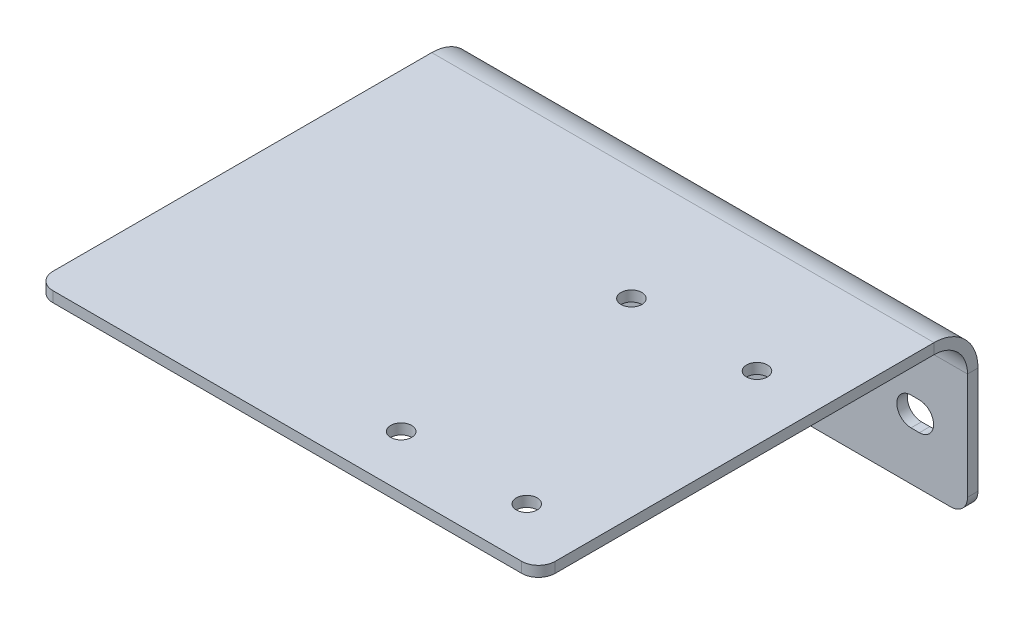
ISO-10303-21;
HEADER;
FILE_DESCRIPTION(('STEP AP214'),'2;1');
FILE_NAME('part.step','',(''),(''),'','','');
FILE_SCHEMA(('AUTOMOTIVE_DESIGN { 1 0 10303 214 1 1 1 1 }'));
ENDSEC;
DATA;
#1=APPLICATION_CONTEXT('core data for automotive mechanical design processes');
#2=APPLICATION_PROTOCOL_DEFINITION('international standard','automotive_design',2000,#1);
#3=PRODUCT_CONTEXT('',#1,'mechanical');
#4=PRODUCT('Part','Part','',(#3));
#5=PRODUCT_RELATED_PRODUCT_CATEGORY('part','',(#4));
#6=PRODUCT_DEFINITION_FORMATION('','',#4);
#7=PRODUCT_DEFINITION_CONTEXT('part definition',#1,'design');
#8=PRODUCT_DEFINITION('design','',#6,#7);
#9=PRODUCT_DEFINITION_SHAPE('','',#8);
#10=(LENGTH_UNIT() NAMED_UNIT(*) SI_UNIT(.MILLI.,.METRE.));
#11=(NAMED_UNIT(*) PLANE_ANGLE_UNIT() SI_UNIT($,.RADIAN.));
#12=(NAMED_UNIT(*) SI_UNIT($,.STERADIAN.) SOLID_ANGLE_UNIT());
#13=UNCERTAINTY_MEASURE_WITH_UNIT(LENGTH_MEASURE(1.E-05),#10,'distance_accuracy_value','');
#14=(GEOMETRIC_REPRESENTATION_CONTEXT(3) GLOBAL_UNCERTAINTY_ASSIGNED_CONTEXT((#13)) GLOBAL_UNIT_ASSIGNED_CONTEXT((#10,
#11,#12)) REPRESENTATION_CONTEXT('',''));
#15=CARTESIAN_POINT('',(0.,0.,0.));
#16=DIRECTION('',(0.,0.,1.));
#17=DIRECTION('',(1.,0.,0.));
#18=AXIS2_PLACEMENT_3D('',#15,#16,#17);
#19=CARTESIAN_POINT('',(0.,25.4,1.5875));
#20=DIRECTION('',(0.,0.,-1.));
#21=DIRECTION('',(-1.,0.,0.));
#22=AXIS2_PLACEMENT_3D('',#19,#20,#21);
#23=PLANE('',#22);
#24=DIRECTION('',(1.,0.,0.));
#25=VECTOR('',#24,1.);
#26=CARTESIAN_POINT('',(7.3025,7.37235,1.5875));
#27=LINE('',#26,#25);
#28=CARTESIAN_POINT('',(7.3025,7.37235,1.5875));
#29=VERTEX_POINT('',#28);
#30=CARTESIAN_POINT('',(8.5725,7.37235,1.5875));
#31=VERTEX_POINT('',#30);
#32=EDGE_CURVE('E240',#29,#31,#27,.T.);
#33=ORIENTED_EDGE('',*,*,#32,.F.);
#34=CARTESIAN_POINT('',(7.3025,9.525,1.5875));
#35=DIRECTION('',(0.,0.,1.));
#36=DIRECTION('',(1.,0.,0.));
#37=AXIS2_PLACEMENT_3D('',#34,#35,#36);
#38=CIRCLE('',#37,2.15265);
#39=CARTESIAN_POINT('',(7.3025,11.67765,1.5875));
#40=VERTEX_POINT('',#39);
#41=EDGE_CURVE('E79',#40,#29,#38,.T.);
#42=ORIENTED_EDGE('',*,*,#41,.F.);
#43=DIRECTION('',(-1.,0.,0.));
#44=VECTOR('',#43,1.);
#45=CARTESIAN_POINT('',(7.3025,11.67765,1.5875));
#46=LINE('',#45,#44);
#47=CARTESIAN_POINT('',(8.5725,11.67765,1.5875));
#48=VERTEX_POINT('',#47);
#49=EDGE_CURVE('E224',#48,#40,#46,.T.);
#50=ORIENTED_EDGE('',*,*,#49,.F.);
#51=CARTESIAN_POINT('',(8.5725,9.525,1.5875));
#52=DIRECTION('',(0.,0.,1.));
#53=DIRECTION('',(1.,0.,0.));
#54=AXIS2_PLACEMENT_3D('',#51,#52,#53);
#55=CIRCLE('',#54,2.15265);
#56=EDGE_CURVE('E228',#31,#48,#55,.T.);
#57=ORIENTED_EDGE('',*,*,#56,.F.);
#58=EDGE_LOOP('',(#33,#42,#50,#57));
#59=FACE_BOUND('',#58,.T.);
#60=DIRECTION('',(1.,0.,0.));
#61=VECTOR('',#60,1.);
#62=CARTESIAN_POINT('',(67.6275,7.37235,1.5875));
#63=LINE('',#62,#61);
#64=CARTESIAN_POINT('',(67.6275,7.37235,1.5875));
#65=VERTEX_POINT('',#64);
#66=CARTESIAN_POINT('',(68.8975,7.37235,1.5875));
#67=VERTEX_POINT('',#66);
#68=EDGE_CURVE('E276',#65,#67,#63,.T.);
#69=ORIENTED_EDGE('',*,*,#68,.F.);
#70=CARTESIAN_POINT('',(67.6275,9.525,1.5875));
#71=DIRECTION('',(0.,0.,1.));
#72=DIRECTION('',(1.,0.,0.));
#73=AXIS2_PLACEMENT_3D('',#70,#71,#72);
#74=CIRCLE('',#73,2.15265);
#75=CARTESIAN_POINT('',(67.6275,11.67765,1.5875));
#76=VERTEX_POINT('',#75);
#77=EDGE_CURVE('E87',#76,#65,#74,.T.);
#78=ORIENTED_EDGE('',*,*,#77,.F.);
#79=DIRECTION('',(-1.,0.,0.));
#80=VECTOR('',#79,1.);
#81=CARTESIAN_POINT('',(67.6275,11.67765,1.5875));
#82=LINE('',#81,#80);
#83=CARTESIAN_POINT('',(68.8975,11.67765,1.5875));
#84=VERTEX_POINT('',#83);
#85=EDGE_CURVE('E261',#84,#76,#82,.T.);
#86=ORIENTED_EDGE('',*,*,#85,.F.);
#87=CARTESIAN_POINT('',(68.8975,9.525,1.5875));
#88=DIRECTION('',(0.,0.,1.));
#89=DIRECTION('',(1.,0.,0.));
#90=AXIS2_PLACEMENT_3D('',#87,#88,#89);
#91=CIRCLE('',#90,2.15265);
#92=EDGE_CURVE('E281',#67,#84,#91,.T.);
#93=ORIENTED_EDGE('',*,*,#92,.F.);
#94=EDGE_LOOP('',(#69,#78,#86,#93));
#95=FACE_BOUND('',#94,.T.);
#96=DIRECTION('',(0.,-1.,0.));
#97=VECTOR('',#96,1.);
#98=CARTESIAN_POINT('',(0.,25.4,1.5875));
#99=LINE('',#98,#97);
#100=CARTESIAN_POINT('',(0.,18.7325,1.5875));
#101=VERTEX_POINT('',#100);
#102=CARTESIAN_POINT('',(0.,2.54,1.5875));
#103=VERTEX_POINT('',#102);
#104=EDGE_CURVE('E373',#101,#103,#99,.T.);
#105=ORIENTED_EDGE('',*,*,#104,.T.);
#106=CARTESIAN_POINT('',(2.54,2.54,1.5875));
#107=DIRECTION('',(0.,0.,-1.));
#108=DIRECTION('',(-1.,0.,0.));
#109=AXIS2_PLACEMENT_3D('',#106,#107,#108);
#110=CIRCLE('',#109,2.54);
#111=CARTESIAN_POINT('',(2.54,0.,1.5875));
#112=VERTEX_POINT('',#111);
#113=EDGE_CURVE('E409',#103,#112,#110,.F.);
#114=ORIENTED_EDGE('',*,*,#113,.T.);
#115=DIRECTION('',(1.,0.,0.));
#116=VECTOR('',#115,1.);
#117=CARTESIAN_POINT('',(0.,0.,1.5875));
#118=LINE('',#117,#116);
#119=CARTESIAN_POINT('',(73.66,0.,1.5875));
#120=VERTEX_POINT('',#119);
#121=EDGE_CURVE('E362',#112,#120,#118,.T.);
#122=ORIENTED_EDGE('',*,*,#121,.T.);
#123=CARTESIAN_POINT('',(73.66,2.54,1.5875));
#124=DIRECTION('',(0.,0.,-1.));
#125=DIRECTION('',(-1.,0.,0.));
#126=AXIS2_PLACEMENT_3D('',#123,#124,#125);
#127=CIRCLE('',#126,2.54);
#128=CARTESIAN_POINT('',(76.2,2.54,1.5875));
#129=VERTEX_POINT('',#128);
#130=EDGE_CURVE('E406',#120,#129,#127,.F.);
#131=ORIENTED_EDGE('',*,*,#130,.T.);
#132=DIRECTION('',(0.,-1.,0.));
#133=VECTOR('',#132,1.);
#134=CARTESIAN_POINT('',(76.2,25.4,1.5875));
#135=LINE('',#134,#133);
#136=CARTESIAN_POINT('',(76.2,18.7325,1.5875));
#137=VERTEX_POINT('',#136);
#138=EDGE_CURVE('E385',#137,#129,#135,.T.);
#139=ORIENTED_EDGE('',*,*,#138,.F.);
#140=DIRECTION('',(-1.,0.,0.));
#141=VECTOR('',#140,1.);
#142=CARTESIAN_POINT('',(0.,18.7325,1.5875));
#143=LINE('',#142,#141);
#144=EDGE_CURVE('E352',#101,#137,#143,.F.);
#145=ORIENTED_EDGE('',*,*,#144,.F.);
#146=EDGE_LOOP('',(#105,#114,#122,#131,#139,#145));
#147=FACE_BOUND('',#146,.T.);
#148=ADVANCED_FACE('F63',(#59,#95,#147),#23,.F.);
#149=CARTESIAN_POINT('',(0.,25.4,0.));
#150=DIRECTION('',(0.,0.,-1.));
#151=DIRECTION('',(-1.,0.,0.));
#152=AXIS2_PLACEMENT_3D('',#149,#150,#151);
#153=PLANE('',#152);
#154=CARTESIAN_POINT('',(7.3025,9.525,0.));
#155=DIRECTION('',(0.,0.,1.));
#156=DIRECTION('',(1.,0.,0.));
#157=AXIS2_PLACEMENT_3D('',#154,#155,#156);
#158=CIRCLE('',#157,2.15265);
#159=CARTESIAN_POINT('',(7.3025,11.67765,0.));
#160=VERTEX_POINT('',#159);
#161=CARTESIAN_POINT('',(7.3025,7.37235,0.));
#162=VERTEX_POINT('',#161);
#163=EDGE_CURVE('E202',#160,#162,#158,.T.);
#164=ORIENTED_EDGE('',*,*,#163,.T.);
#165=DIRECTION('',(1.,0.,0.));
#166=VECTOR('',#165,1.);
#167=CARTESIAN_POINT('',(7.3025,7.37235,0.));
#168=LINE('',#167,#166);
#169=CARTESIAN_POINT('',(8.5725,7.37235,0.));
#170=VERTEX_POINT('',#169);
#171=EDGE_CURVE('E213',#162,#170,#168,.T.);
#172=ORIENTED_EDGE('',*,*,#171,.T.);
#173=CARTESIAN_POINT('',(8.5725,9.525,0.));
#174=DIRECTION('',(0.,0.,1.));
#175=DIRECTION('',(1.,0.,0.));
#176=AXIS2_PLACEMENT_3D('',#173,#174,#175);
#177=CIRCLE('',#176,2.15265);
#178=CARTESIAN_POINT('',(8.5725,11.67765,0.));
#179=VERTEX_POINT('',#178);
#180=EDGE_CURVE('E218',#170,#179,#177,.T.);
#181=ORIENTED_EDGE('',*,*,#180,.T.);
#182=DIRECTION('',(-1.,0.,0.));
#183=VECTOR('',#182,1.);
#184=CARTESIAN_POINT('',(7.3025,11.67765,0.));
#185=LINE('',#184,#183);
#186=EDGE_CURVE('E209',#179,#160,#185,.T.);
#187=ORIENTED_EDGE('',*,*,#186,.T.);
#188=EDGE_LOOP('',(#164,#172,#181,#187));
#189=FACE_BOUND('',#188,.T.);
#190=CARTESIAN_POINT('',(67.6275,9.525,0.));
#191=DIRECTION('',(0.,0.,1.));
#192=DIRECTION('',(1.,0.,0.));
#193=AXIS2_PLACEMENT_3D('',#190,#191,#192);
#194=CIRCLE('',#193,2.15265);
#195=CARTESIAN_POINT('',(67.6275,11.67765,0.));
#196=VERTEX_POINT('',#195);
#197=CARTESIAN_POINT('',(67.6275,7.37235,0.));
#198=VERTEX_POINT('',#197);
#199=EDGE_CURVE('E256',#196,#198,#194,.T.);
#200=ORIENTED_EDGE('',*,*,#199,.T.);
#201=DIRECTION('',(1.,0.,0.));
#202=VECTOR('',#201,1.);
#203=CARTESIAN_POINT('',(67.6275,7.37235,0.));
#204=LINE('',#203,#202);
#205=CARTESIAN_POINT('',(68.8975,7.37235,0.));
#206=VERTEX_POINT('',#205);
#207=EDGE_CURVE('E260',#198,#206,#204,.T.);
#208=ORIENTED_EDGE('',*,*,#207,.T.);
#209=CARTESIAN_POINT('',(68.8975,9.525,0.));
#210=DIRECTION('',(0.,0.,1.));
#211=DIRECTION('',(1.,0.,0.));
#212=AXIS2_PLACEMENT_3D('',#209,#210,#211);
#213=CIRCLE('',#212,2.15265);
#214=CARTESIAN_POINT('',(68.8975,11.67765,0.));
#215=VERTEX_POINT('',#214);
#216=EDGE_CURVE('E265',#206,#215,#213,.T.);
#217=ORIENTED_EDGE('',*,*,#216,.T.);
#218=DIRECTION('',(-1.,0.,0.));
#219=VECTOR('',#218,1.);
#220=CARTESIAN_POINT('',(67.6275,11.67765,0.));
#221=LINE('',#220,#219);
#222=EDGE_CURVE('E269',#215,#196,#221,.T.);
#223=ORIENTED_EDGE('',*,*,#222,.T.);
#224=EDGE_LOOP('',(#200,#208,#217,#223));
#225=FACE_BOUND('',#224,.T.);
#226=DIRECTION('',(1.,0.,0.));
#227=VECTOR('',#226,1.);
#228=CARTESIAN_POINT('',(0.,0.,0.));
#229=LINE('',#228,#227);
#230=CARTESIAN_POINT('',(2.54,0.,0.));
#231=VERTEX_POINT('',#230);
#232=CARTESIAN_POINT('',(73.66,0.,0.));
#233=VERTEX_POINT('',#232);
#234=EDGE_CURVE('E369',#231,#233,#229,.T.);
#235=ORIENTED_EDGE('',*,*,#234,.F.);
#236=CARTESIAN_POINT('',(2.54,2.54,0.));
#237=DIRECTION('',(0.,0.,-1.));
#238=DIRECTION('',(-1.,0.,0.));
#239=AXIS2_PLACEMENT_3D('',#236,#237,#238);
#240=CIRCLE('',#239,2.54);
#241=CARTESIAN_POINT('',(0.,2.54,0.));
#242=VERTEX_POINT('',#241);
#243=EDGE_CURVE('E400',#231,#242,#240,.T.);
#244=ORIENTED_EDGE('',*,*,#243,.T.);
#245=DIRECTION('',(0.,-1.,0.));
#246=VECTOR('',#245,1.);
#247=CARTESIAN_POINT('',(0.,25.4,0.));
#248=LINE('',#247,#246);
#249=CARTESIAN_POINT('',(0.,18.7325,0.));
#250=VERTEX_POINT('',#249);
#251=EDGE_CURVE('E377',#250,#242,#248,.T.);
#252=ORIENTED_EDGE('',*,*,#251,.F.);
#253=DIRECTION('',(-1.,0.,0.));
#254=VECTOR('',#253,1.);
#255=CARTESIAN_POINT('',(0.,18.7325,0.));
#256=LINE('',#255,#254);
#257=CARTESIAN_POINT('',(76.2,18.7325,0.));
#258=VERTEX_POINT('',#257);
#259=EDGE_CURVE('E335',#250,#258,#256,.F.);
#260=ORIENTED_EDGE('',*,*,#259,.T.);
#261=DIRECTION('',(0.,-1.,0.));
#262=VECTOR('',#261,1.);
#263=CARTESIAN_POINT('',(76.2,25.4,0.));
#264=LINE('',#263,#262);
#265=CARTESIAN_POINT('',(76.2,2.54,0.));
#266=VERTEX_POINT('',#265);
#267=EDGE_CURVE('E381',#258,#266,#264,.T.);
#268=ORIENTED_EDGE('',*,*,#267,.T.);
#269=CARTESIAN_POINT('',(73.66,2.54,0.));
#270=DIRECTION('',(0.,0.,-1.));
#271=DIRECTION('',(-1.,0.,0.));
#272=AXIS2_PLACEMENT_3D('',#269,#270,#271);
#273=CIRCLE('',#272,2.54);
#274=EDGE_CURVE('E397',#266,#233,#273,.T.);
#275=ORIENTED_EDGE('',*,*,#274,.T.);
#276=EDGE_LOOP('',(#235,#244,#252,#260,#268,#275));
#277=FACE_BOUND('',#276,.T.);
#278=ADVANCED_FACE('F220',(#189,#225,#277),#153,.T.);
#279=CARTESIAN_POINT('',(0.,25.4,1.5875));
#280=DIRECTION('',(-1.,0.,0.));
#281=DIRECTION('',(0.,0.,1.));
#282=AXIS2_PLACEMENT_3D('',#279,#280,#281);
#283=PLANE('',#282);
#284=ORIENTED_EDGE('',*,*,#251,.T.);
#285=DIRECTION('',(0.,0.,-1.));
#286=VECTOR('',#285,1.);
#287=CARTESIAN_POINT('',(0.,2.54,1.5875));
#288=LINE('',#287,#286);
#289=EDGE_CURVE('E403',#242,#103,#288,.F.);
#290=ORIENTED_EDGE('',*,*,#289,.T.);
#291=ORIENTED_EDGE('',*,*,#104,.F.);
#292=DIRECTION('',(0.,0.,-1.));
#293=VECTOR('',#292,1.);
#294=CARTESIAN_POINT('',(0.,18.7325,1.5875));
#295=LINE('',#294,#293);
#296=EDGE_CURVE('E344',#101,#250,#295,.T.);
#297=ORIENTED_EDGE('',*,*,#296,.T.);
#298=EDGE_LOOP('',(#284,#290,#291,#297));
#299=FACE_BOUND('',#298,.T.);
#300=ADVANCED_FACE('F494',(#299),#283,.T.);
#301=CARTESIAN_POINT('',(76.2,25.4,0.));
#302=DIRECTION('',(1.,0.,0.));
#303=DIRECTION('',(0.,0.,-1.));
#304=AXIS2_PLACEMENT_3D('',#301,#302,#303);
#305=PLANE('',#304);
#306=ORIENTED_EDGE('',*,*,#138,.T.);
#307=DIRECTION('',(0.,0.,1.));
#308=VECTOR('',#307,1.);
#309=CARTESIAN_POINT('',(76.2,2.54,0.));
#310=LINE('',#309,#308);
#311=EDGE_CURVE('E412',#129,#266,#310,.F.);
#312=ORIENTED_EDGE('',*,*,#311,.T.);
#313=ORIENTED_EDGE('',*,*,#267,.F.);
#314=DIRECTION('',(0.,0.,-1.));
#315=VECTOR('',#314,1.);
#316=CARTESIAN_POINT('',(76.2,18.7325,1.5875));
#317=LINE('',#316,#315);
#318=EDGE_CURVE('E358',#137,#258,#317,.T.);
#319=ORIENTED_EDGE('',*,*,#318,.F.);
#320=EDGE_LOOP('',(#306,#312,#313,#319));
#321=FACE_BOUND('',#320,.T.);
#322=ADVANCED_FACE('F480',(#321),#305,.T.);
#323=CARTESIAN_POINT('',(0.,0.,0.));
#324=DIRECTION('',(0.,-1.,0.));
#325=DIRECTION('',(-1.,0.,0.));
#326=AXIS2_PLACEMENT_3D('',#323,#324,#325);
#327=PLANE('',#326);
#328=ORIENTED_EDGE('',*,*,#121,.F.);
#329=DIRECTION('',(0.,0.,-1.));
#330=VECTOR('',#329,1.);
#331=CARTESIAN_POINT('',(2.54,0.,0.));
#332=LINE('',#331,#330);
#333=EDGE_CURVE('E393',#112,#231,#332,.T.);
#334=ORIENTED_EDGE('',*,*,#333,.T.);
#335=ORIENTED_EDGE('',*,*,#234,.T.);
#336=DIRECTION('',(0.,0.,1.));
#337=VECTOR('',#336,1.);
#338=CARTESIAN_POINT('',(73.66,0.,0.));
#339=LINE('',#338,#337);
#340=EDGE_CURVE('E389',#233,#120,#339,.T.);
#341=ORIENTED_EDGE('',*,*,#340,.T.);
#342=EDGE_LOOP('',(#328,#334,#335,#341));
#343=FACE_BOUND('',#342,.T.);
#344=ADVANCED_FACE('F487',(#343),#327,.T.);
#345=CARTESIAN_POINT('',(76.2,18.7325,6.6675));
#346=DIRECTION('',(1.,0.,0.));
#347=DIRECTION('',(0.,0.,-1.));
#348=AXIS2_PLACEMENT_3D('',#345,#346,#347);
#349=PLANE('',#348);
#350=DIRECTION('',(0.,-1.,0.));
#351=VECTOR('',#350,1.);
#352=CARTESIAN_POINT('',(76.2,25.4,6.66749999999997));
#353=LINE('',#352,#351);
#354=CARTESIAN_POINT('',(76.2,23.8125,6.66749999999998));
#355=VERTEX_POINT('',#354);
#356=CARTESIAN_POINT('',(76.2,25.4,6.66749999999997));
#357=VERTEX_POINT('',#356);
#358=EDGE_CURVE('E250',#355,#357,#353,.F.);
#359=ORIENTED_EDGE('',*,*,#358,.F.);
#360=CARTESIAN_POINT('',(76.2,18.7325,6.6675));
#361=DIRECTION('',(-1.,0.,0.));
#362=DIRECTION('',(0.,0.,1.));
#363=AXIS2_PLACEMENT_3D('',#360,#361,#362);
#364=CIRCLE('',#363,5.08);
#365=EDGE_CURVE('E348',#137,#355,#364,.F.);
#366=ORIENTED_EDGE('',*,*,#365,.F.);
#367=ORIENTED_EDGE('',*,*,#318,.T.);
#368=CARTESIAN_POINT('',(76.2,18.7325,6.6675));
#369=DIRECTION('',(-1.,0.,0.));
#370=DIRECTION('',(0.,0.,1.));
#371=AXIS2_PLACEMENT_3D('',#368,#369,#370);
#372=CIRCLE('',#371,6.6675);
#373=EDGE_CURVE('E339',#258,#357,#372,.F.);
#374=ORIENTED_EDGE('',*,*,#373,.T.);
#375=EDGE_LOOP('',(#359,#366,#367,#374));
#376=FACE_BOUND('',#375,.T.);
#377=ADVANCED_FACE('F470',(#376),#349,.T.);
#378=CARTESIAN_POINT('',(0.,18.7325,6.6675));
#379=DIRECTION('',(1.,0.,0.));
#380=DIRECTION('',(0.,0.,-1.));
#381=AXIS2_PLACEMENT_3D('',#378,#379,#380);
#382=PLANE('',#381);
#383=CARTESIAN_POINT('',(0.,18.7325,6.6675));
#384=DIRECTION('',(-1.,0.,0.));
#385=DIRECTION('',(0.,0.,1.));
#386=AXIS2_PLACEMENT_3D('',#383,#384,#385);
#387=CIRCLE('',#386,5.08);
#388=CARTESIAN_POINT('',(0.,23.8125,6.66749999999998));
#389=VERTEX_POINT('',#388);
#390=EDGE_CURVE('E301',#389,#101,#387,.T.);
#391=ORIENTED_EDGE('',*,*,#390,.F.);
#392=DIRECTION('',(0.,-1.,0.));
#393=VECTOR('',#392,1.);
#394=CARTESIAN_POINT('',(0.,23.8125,6.66749999999998));
#395=LINE('',#394,#393);
#396=CARTESIAN_POINT('',(0.,25.4,6.66749999999997));
#397=VERTEX_POINT('',#396);
#398=EDGE_CURVE('E325',#389,#397,#395,.F.);
#399=ORIENTED_EDGE('',*,*,#398,.T.);
#400=CARTESIAN_POINT('',(0.,18.7325,6.6675));
#401=DIRECTION('',(-1.,0.,0.));
#402=DIRECTION('',(0.,0.,1.));
#403=AXIS2_PLACEMENT_3D('',#400,#401,#402);
#404=CIRCLE('',#403,6.6675);
#405=EDGE_CURVE('E340',#397,#250,#404,.T.);
#406=ORIENTED_EDGE('',*,*,#405,.T.);
#407=ORIENTED_EDGE('',*,*,#296,.F.);
#408=EDGE_LOOP('',(#391,#399,#406,#407));
#409=FACE_BOUND('',#408,.T.);
#410=ADVANCED_FACE('F466',(#409),#382,.F.);
#411=CARTESIAN_POINT('',(0.,18.7325,6.6675));
#412=DIRECTION('',(-1.,0.,0.));
#413=DIRECTION('',(0.,1.,0.));
#414=AXIS2_PLACEMENT_3D('',#411,#412,#413);
#415=CYLINDRICAL_SURFACE('',#414,6.6675);
#416=ORIENTED_EDGE('',*,*,#259,.F.);
#417=ORIENTED_EDGE('',*,*,#405,.F.);
#418=DIRECTION('',(-1.,0.,0.));
#419=VECTOR('',#418,1.);
#420=CARTESIAN_POINT('',(76.2,25.4,6.66749999999997));
#421=LINE('',#420,#419);
#422=EDGE_CURVE('E321',#397,#357,#421,.F.);
#423=ORIENTED_EDGE('',*,*,#422,.T.);
#424=ORIENTED_EDGE('',*,*,#373,.F.);
#425=EDGE_LOOP('',(#416,#417,#423,#424));
#426=FACE_BOUND('',#425,.T.);
#427=ADVANCED_FACE('F468',(#426),#415,.T.);
#428=CARTESIAN_POINT('',(0.,18.7325,6.6675));
#429=DIRECTION('',(-1.,0.,0.));
#430=DIRECTION('',(0.,1.,0.));
#431=AXIS2_PLACEMENT_3D('',#428,#429,#430);
#432=CYLINDRICAL_SURFACE('',#431,5.08);
#433=ORIENTED_EDGE('',*,*,#144,.T.);
#434=ORIENTED_EDGE('',*,*,#365,.T.);
#435=DIRECTION('',(-1.,0.,0.));
#436=VECTOR('',#435,1.);
#437=CARTESIAN_POINT('',(76.2,23.8125,6.66749999999998));
#438=LINE('',#437,#436);
#439=EDGE_CURVE('E329',#355,#389,#438,.T.);
#440=ORIENTED_EDGE('',*,*,#439,.T.);
#441=ORIENTED_EDGE('',*,*,#390,.T.);
#442=EDGE_LOOP('',(#433,#434,#440,#441));
#443=FACE_BOUND('',#442,.T.);
#444=ADVANCED_FACE('F498',(#443),#432,.F.);
#445=CARTESIAN_POINT('',(0.,25.4000000000002,66.675));
#446=DIRECTION('',(1.,0.,0.));
#447=DIRECTION('',(0.,0.,-1.));
#448=AXIS2_PLACEMENT_3D('',#445,#446,#447);
#449=PLANE('',#448);
#450=DIRECTION('',(0.,0.,-1.));
#451=VECTOR('',#450,1.);
#452=CARTESIAN_POINT('',(0.,23.8125000000002,66.675));
#453=LINE('',#452,#451);
#454=CARTESIAN_POINT('',(0.,23.8125000000002,64.135));
#455=VERTEX_POINT('',#454);
#456=EDGE_CURVE('E317',#389,#455,#453,.F.);
#457=ORIENTED_EDGE('',*,*,#456,.T.);
#458=DIRECTION('',(0.,-1.,0.));
#459=VECTOR('',#458,1.);
#460=CARTESIAN_POINT('',(0.,25.4000000000002,64.135));
#461=LINE('',#460,#459);
#462=CARTESIAN_POINT('',(0.,25.4000000000002,64.135));
#463=VERTEX_POINT('',#462);
#464=EDGE_CURVE('E13',#455,#463,#461,.F.);
#465=ORIENTED_EDGE('',*,*,#464,.T.);
#466=DIRECTION('',(0.,0.,1.));
#467=VECTOR('',#466,1.);
#468=CARTESIAN_POINT('',(0.,25.4,0.));
#469=LINE('',#468,#467);
#470=EDGE_CURVE('E306',#397,#463,#469,.T.);
#471=ORIENTED_EDGE('',*,*,#470,.F.);
#472=ORIENTED_EDGE('',*,*,#398,.F.);
#473=EDGE_LOOP('',(#457,#465,#471,#472));
#474=FACE_BOUND('',#473,.T.);
#475=ADVANCED_FACE('F462',(#474),#449,.F.);
#476=CARTESIAN_POINT('',(76.2,25.4,1.58749999999999));
#477=DIRECTION('',(-1.,0.,0.));
#478=DIRECTION('',(0.,0.,1.));
#479=AXIS2_PLACEMENT_3D('',#476,#477,#478);
#480=PLANE('',#479);
#481=DIRECTION('',(0.,0.,-1.));
#482=VECTOR('',#481,1.);
#483=CARTESIAN_POINT('',(76.2,25.4,0.));
#484=LINE('',#483,#482);
#485=CARTESIAN_POINT('',(76.2,25.4000000000002,64.135));
#486=VERTEX_POINT('',#485);
#487=EDGE_CURVE('E298',#486,#357,#484,.T.);
#488=ORIENTED_EDGE('',*,*,#487,.F.);
#489=DIRECTION('',(0.,-1.,0.));
#490=VECTOR('',#489,1.);
#491=CARTESIAN_POINT('',(76.2,25.4000000000002,64.135));
#492=LINE('',#491,#490);
#493=CARTESIAN_POINT('',(76.2,23.8125000000002,64.135));
#494=VERTEX_POINT('',#493);
#495=EDGE_CURVE('E415',#486,#494,#492,.T.);
#496=ORIENTED_EDGE('',*,*,#495,.T.);
#497=DIRECTION('',(0.,0.,1.));
#498=VECTOR('',#497,1.);
#499=CARTESIAN_POINT('',(76.2,23.8125,1.5875));
#500=LINE('',#499,#498);
#501=EDGE_CURVE('E310',#494,#355,#500,.F.);
#502=ORIENTED_EDGE('',*,*,#501,.T.);
#503=ORIENTED_EDGE('',*,*,#358,.T.);
#504=EDGE_LOOP('',(#488,#496,#502,#503));
#505=FACE_BOUND('',#504,.T.);
#506=ADVANCED_FACE('F445',(#505),#480,.F.);
#507=CARTESIAN_POINT('',(0.,25.4,0.));
#508=DIRECTION('',(0.,-1.,0.));
#509=DIRECTION('',(0.,0.,-1.));
#510=AXIS2_PLACEMENT_3D('',#507,#508,#509);
#511=PLANE('',#510);
#512=CARTESIAN_POINT('',(47.4472,25.4000000000004,58.7502));
#513=DIRECTION('',(0.,-1.,0.));
#514=DIRECTION('',(0.,0.,-1.));
#515=AXIS2_PLACEMENT_3D('',#512,#513,#514);
#516=CIRCLE('',#515,1.5875);
#517=CARTESIAN_POINT('',(47.4472,25.4000000000004,57.1627));
#518=VERTEX_POINT('',#517);
#519=EDGE_CURVE('E816',#518,#518,#516,.T.);
#520=ORIENTED_EDGE('',*,*,#519,.T.);
#521=EDGE_LOOP('',(#520));
#522=FACE_BOUND('',#521,.T.);
#523=CARTESIAN_POINT('',(47.4472,25.4000000000003,23.8252));
#524=DIRECTION('',(0.,-1.,0.));
#525=DIRECTION('',(0.,0.,-1.));
#526=AXIS2_PLACEMENT_3D('',#523,#524,#525);
#527=CIRCLE('',#526,1.5875);
#528=CARTESIAN_POINT('',(47.4472,25.4000000000003,22.2377));
#529=VERTEX_POINT('',#528);
#530=EDGE_CURVE('E843',#529,#529,#527,.T.);
#531=ORIENTED_EDGE('',*,*,#530,.T.);
#532=EDGE_LOOP('',(#531));
#533=FACE_BOUND('',#532,.T.);
#534=CARTESIAN_POINT('',(66.4972,25.4000000000003,23.8252));
#535=DIRECTION('',(0.,-1.,0.));
#536=DIRECTION('',(0.,0.,-1.));
#537=AXIS2_PLACEMENT_3D('',#534,#535,#536);
#538=CIRCLE('',#537,1.5875);
#539=CARTESIAN_POINT('',(66.4972,25.4000000000003,22.2377));
#540=VERTEX_POINT('',#539);
#541=EDGE_CURVE('E832',#540,#540,#538,.T.);
#542=ORIENTED_EDGE('',*,*,#541,.T.);
#543=EDGE_LOOP('',(#542));
#544=FACE_BOUND('',#543,.T.);
#545=CARTESIAN_POINT('',(66.4972,25.4000000000004,58.7502));
#546=DIRECTION('',(0.,-1.,0.));
#547=DIRECTION('',(0.,0.,-1.));
#548=AXIS2_PLACEMENT_3D('',#545,#546,#547);
#549=CIRCLE('',#548,1.58749999999999);
#550=CARTESIAN_POINT('',(66.4972,25.4000000000004,57.1627));
#551=VERTEX_POINT('',#550);
#552=EDGE_CURVE('E277',#551,#551,#549,.T.);
#553=ORIENTED_EDGE('',*,*,#552,.T.);
#554=EDGE_LOOP('',(#553));
#555=FACE_BOUND('',#554,.T.);
#556=DIRECTION('',(1.,0.,0.));
#557=VECTOR('',#556,1.);
#558=CARTESIAN_POINT('',(0.,25.4000000000002,66.675));
#559=LINE('',#558,#557);
#560=CARTESIAN_POINT('',(2.54000000000003,25.4000000000002,66.675));
#561=VERTEX_POINT('',#560);
#562=CARTESIAN_POINT('',(73.66,25.4000000000002,66.675));
#563=VERTEX_POINT('',#562);
#564=EDGE_CURVE('E302',#561,#563,#559,.T.);
#565=ORIENTED_EDGE('',*,*,#564,.T.);
#566=CARTESIAN_POINT('',(73.66,25.4000000000002,64.135));
#567=DIRECTION('',(0.,-1.,0.));
#568=DIRECTION('',(0.,0.,-1.));
#569=AXIS2_PLACEMENT_3D('',#566,#567,#568);
#570=CIRCLE('',#569,2.54);
#571=EDGE_CURVE('E72',#563,#486,#570,.F.);
#572=ORIENTED_EDGE('',*,*,#571,.T.);
#573=ORIENTED_EDGE('',*,*,#487,.T.);
#574=ORIENTED_EDGE('',*,*,#422,.F.);
#575=ORIENTED_EDGE('',*,*,#470,.T.);
#576=CARTESIAN_POINT('',(2.54000000000003,25.4000000000002,64.135));
#577=DIRECTION('',(0.,-1.,0.));
#578=DIRECTION('',(0.,0.,-1.));
#579=AXIS2_PLACEMENT_3D('',#576,#577,#578);
#580=CIRCLE('',#579,2.54);
#581=EDGE_CURVE('E432',#463,#561,#580,.F.);
#582=ORIENTED_EDGE('',*,*,#581,.T.);
#583=EDGE_LOOP('',(#565,#572,#573,#574,#575,#582));
#584=FACE_BOUND('',#583,.T.);
#585=ADVANCED_FACE('F438',(#522,#533,#544,#555,#584),#511,.F.);
#586=CARTESIAN_POINT('',(0.,23.8125,0.));
#587=DIRECTION('',(0.,-1.,0.));
#588=DIRECTION('',(0.,0.,-1.));
#589=AXIS2_PLACEMENT_3D('',#586,#587,#588);
#590=PLANE('',#589);
#591=CARTESIAN_POINT('',(47.4472,23.8125000000002,58.7502));
#592=DIRECTION('',(0.,-1.,0.));
#593=DIRECTION('',(0.,0.,-1.));
#594=AXIS2_PLACEMENT_3D('',#591,#592,#593);
#595=CIRCLE('',#594,1.5875);
#596=CARTESIAN_POINT('',(47.4472,23.8125000000002,57.1627));
#597=VERTEX_POINT('',#596);
#598=EDGE_CURVE('E819',#597,#597,#595,.T.);
#599=ORIENTED_EDGE('',*,*,#598,.F.);
#600=EDGE_LOOP('',(#599));
#601=FACE_BOUND('',#600,.T.);
#602=CARTESIAN_POINT('',(47.4472,23.8125000000001,23.8252));
#603=DIRECTION('',(0.,-1.,0.));
#604=DIRECTION('',(0.,0.,-1.));
#605=AXIS2_PLACEMENT_3D('',#602,#603,#604);
#606=CIRCLE('',#605,1.5875);
#607=CARTESIAN_POINT('',(47.4472,23.8125000000001,22.2377));
#608=VERTEX_POINT('',#607);
#609=EDGE_CURVE('E823',#608,#608,#606,.T.);
#610=ORIENTED_EDGE('',*,*,#609,.F.);
#611=EDGE_LOOP('',(#610));
#612=FACE_BOUND('',#611,.T.);
#613=CARTESIAN_POINT('',(66.4972,23.8125000000001,23.8252));
#614=DIRECTION('',(0.,-1.,0.));
#615=DIRECTION('',(0.,0.,-1.));
#616=AXIS2_PLACEMENT_3D('',#613,#614,#615);
#617=CIRCLE('',#616,1.5875);
#618=CARTESIAN_POINT('',(66.4972,23.8125000000001,22.2377));
#619=VERTEX_POINT('',#618);
#620=EDGE_CURVE('E837',#619,#619,#617,.T.);
#621=ORIENTED_EDGE('',*,*,#620,.F.);
#622=EDGE_LOOP('',(#621));
#623=FACE_BOUND('',#622,.T.);
#624=CARTESIAN_POINT('',(66.4972,23.8125000000002,58.7502));
#625=DIRECTION('',(0.,-1.,0.));
#626=DIRECTION('',(0.,0.,-1.));
#627=AXIS2_PLACEMENT_3D('',#624,#625,#626);
#628=CIRCLE('',#627,1.58749999999999);
#629=CARTESIAN_POINT('',(66.4972,23.8125000000002,57.1627));
#630=VERTEX_POINT('',#629);
#631=EDGE_CURVE('E231',#630,#630,#628,.T.);
#632=ORIENTED_EDGE('',*,*,#631,.F.);
#633=EDGE_LOOP('',(#632));
#634=FACE_BOUND('',#633,.T.);
#635=ORIENTED_EDGE('',*,*,#501,.F.);
#636=CARTESIAN_POINT('',(73.66,23.8125000000002,64.135));
#637=DIRECTION('',(0.,-1.,0.));
#638=DIRECTION('',(0.,0.,-1.));
#639=AXIS2_PLACEMENT_3D('',#636,#637,#638);
#640=CIRCLE('',#639,2.54);
#641=CARTESIAN_POINT('',(73.66,23.8125000000002,66.675));
#642=VERTEX_POINT('',#641);
#643=EDGE_CURVE('E422',#494,#642,#640,.T.);
#644=ORIENTED_EDGE('',*,*,#643,.T.);
#645=DIRECTION('',(-1.,0.,0.));
#646=VECTOR('',#645,1.);
#647=CARTESIAN_POINT('',(76.2,23.8125000000002,66.675));
#648=LINE('',#647,#646);
#649=CARTESIAN_POINT('',(2.54000000000003,23.8125000000002,66.675));
#650=VERTEX_POINT('',#649);
#651=EDGE_CURVE('E313',#650,#642,#648,.F.);
#652=ORIENTED_EDGE('',*,*,#651,.F.);
#653=CARTESIAN_POINT('',(2.54000000000003,23.8125000000002,64.135));
#654=DIRECTION('',(0.,-1.,0.));
#655=DIRECTION('',(0.,0.,-1.));
#656=AXIS2_PLACEMENT_3D('',#653,#654,#655);
#657=CIRCLE('',#656,2.54);
#658=EDGE_CURVE('E419',#650,#455,#657,.T.);
#659=ORIENTED_EDGE('',*,*,#658,.T.);
#660=ORIENTED_EDGE('',*,*,#456,.F.);
#661=ORIENTED_EDGE('',*,*,#439,.F.);
#662=EDGE_LOOP('',(#635,#644,#652,#659,#660,#661));
#663=FACE_BOUND('',#662,.T.);
#664=ADVANCED_FACE('F451',(#601,#612,#623,#634,#663),#590,.T.);
#665=CARTESIAN_POINT('',(76.2,25.4000000000002,66.675));
#666=DIRECTION('',(0.,0.,-1.));
#667=DIRECTION('',(0.,1.,0.));
#668=AXIS2_PLACEMENT_3D('',#665,#666,#667);
#669=PLANE('',#668);
#670=ORIENTED_EDGE('',*,*,#651,.T.);
#671=DIRECTION('',(0.,-1.,0.));
#672=VECTOR('',#671,1.);
#673=CARTESIAN_POINT('',(73.66,25.4000000000002,66.675));
#674=LINE('',#673,#672);
#675=EDGE_CURVE('E429',#642,#563,#674,.F.);
#676=ORIENTED_EDGE('',*,*,#675,.T.);
#677=ORIENTED_EDGE('',*,*,#564,.F.);
#678=DIRECTION('',(0.,-1.,0.));
#679=VECTOR('',#678,1.);
#680=CARTESIAN_POINT('',(2.54000000000003,25.4000000000002,66.675));
#681=LINE('',#680,#679);
#682=EDGE_CURVE('E425',#561,#650,#681,.T.);
#683=ORIENTED_EDGE('',*,*,#682,.T.);
#684=EDGE_LOOP('',(#670,#676,#677,#683));
#685=FACE_BOUND('',#684,.T.);
#686=ADVANCED_FACE('F454',(#685),#669,.F.);
#687=CARTESIAN_POINT('',(2.54,2.54,0.));
#688=DIRECTION('',(0.,0.,-1.));
#689=DIRECTION('',(-1.,0.,0.));
#690=AXIS2_PLACEMENT_3D('',#687,#688,#689);
#691=CYLINDRICAL_SURFACE('',#690,2.54);
#692=ORIENTED_EDGE('',*,*,#113,.F.);
#693=ORIENTED_EDGE('',*,*,#289,.F.);
#694=ORIENTED_EDGE('',*,*,#243,.F.);
#695=ORIENTED_EDGE('',*,*,#333,.F.);
#696=EDGE_LOOP('',(#692,#693,#694,#695));
#697=FACE_BOUND('',#696,.T.);
#698=ADVANCED_FACE('F491',(#697),#691,.T.);
#699=CARTESIAN_POINT('',(73.66,2.54,0.));
#700=DIRECTION('',(0.,0.,1.));
#701=DIRECTION('',(1.,0.,0.));
#702=AXIS2_PLACEMENT_3D('',#699,#700,#701);
#703=CYLINDRICAL_SURFACE('',#702,2.54);
#704=ORIENTED_EDGE('',*,*,#274,.F.);
#705=ORIENTED_EDGE('',*,*,#311,.F.);
#706=ORIENTED_EDGE('',*,*,#130,.F.);
#707=ORIENTED_EDGE('',*,*,#340,.F.);
#708=EDGE_LOOP('',(#704,#705,#706,#707));
#709=FACE_BOUND('',#708,.T.);
#710=ADVANCED_FACE('F483',(#709),#703,.T.);
#711=CARTESIAN_POINT('',(73.66,25.4000000000002,64.135));
#712=DIRECTION('',(0.,-1.,0.));
#713=DIRECTION('',(0.,0.,-1.));
#714=AXIS2_PLACEMENT_3D('',#711,#712,#713);
#715=CYLINDRICAL_SURFACE('',#714,2.54);
#716=ORIENTED_EDGE('',*,*,#571,.F.);
#717=ORIENTED_EDGE('',*,*,#675,.F.);
#718=ORIENTED_EDGE('',*,*,#643,.F.);
#719=ORIENTED_EDGE('',*,*,#495,.F.);
#720=EDGE_LOOP('',(#716,#717,#718,#719));
#721=FACE_BOUND('',#720,.T.);
#722=ADVANCED_FACE('F448',(#721),#715,.T.);
#723=CARTESIAN_POINT('',(2.54000000000003,25.4000000000002,64.135));
#724=DIRECTION('',(0.,-1.,0.));
#725=DIRECTION('',(0.,0.,-1.));
#726=AXIS2_PLACEMENT_3D('',#723,#724,#725);
#727=CYLINDRICAL_SURFACE('',#726,2.54);
#728=ORIENTED_EDGE('',*,*,#581,.F.);
#729=ORIENTED_EDGE('',*,*,#464,.F.);
#730=ORIENTED_EDGE('',*,*,#658,.F.);
#731=ORIENTED_EDGE('',*,*,#682,.F.);
#732=EDGE_LOOP('',(#728,#729,#730,#731));
#733=FACE_BOUND('',#732,.T.);
#734=ADVANCED_FACE('F65',(#733),#727,.T.);
#735=CARTESIAN_POINT('',(67.6275,9.525,0.));
#736=DIRECTION('',(0.,0.,1.));
#737=DIRECTION('',(1.,0.,0.));
#738=AXIS2_PLACEMENT_3D('',#735,#736,#737);
#739=CYLINDRICAL_SURFACE('',#738,2.15265);
#740=ORIENTED_EDGE('',*,*,#77,.T.);
#741=DIRECTION('',(0.,0.,1.));
#742=VECTOR('',#741,1.);
#743=CARTESIAN_POINT('',(67.6275,7.37235,0.));
#744=LINE('',#743,#742);
#745=EDGE_CURVE('E273',#198,#65,#744,.T.);
#746=ORIENTED_EDGE('',*,*,#745,.F.);
#747=ORIENTED_EDGE('',*,*,#199,.F.);
#748=DIRECTION('',(0.,0.,1.));
#749=VECTOR('',#748,1.);
#750=CARTESIAN_POINT('',(67.6275,11.67765,0.));
#751=LINE('',#750,#749);
#752=EDGE_CURVE('E241',#196,#76,#751,.T.);
#753=ORIENTED_EDGE('',*,*,#752,.T.);
#754=EDGE_LOOP('',(#740,#746,#747,#753));
#755=FACE_BOUND('',#754,.T.);
#756=ADVANCED_FACE('F517',(#755),#739,.F.);
#757=CARTESIAN_POINT('',(67.6275,11.67765,0.));
#758=DIRECTION('',(0.,1.,0.));
#759=DIRECTION('',(0.,0.,1.));
#760=AXIS2_PLACEMENT_3D('',#757,#758,#759);
#761=PLANE('',#760);
#762=ORIENTED_EDGE('',*,*,#85,.T.);
#763=ORIENTED_EDGE('',*,*,#752,.F.);
#764=ORIENTED_EDGE('',*,*,#222,.F.);
#765=DIRECTION('',(0.,0.,1.));
#766=VECTOR('',#765,1.);
#767=CARTESIAN_POINT('',(68.8975,11.67765,0.));
#768=LINE('',#767,#766);
#769=EDGE_CURVE('E290',#215,#84,#768,.T.);
#770=ORIENTED_EDGE('',*,*,#769,.T.);
#771=EDGE_LOOP('',(#762,#763,#764,#770));
#772=FACE_BOUND('',#771,.T.);
#773=ADVANCED_FACE('F521',(#772),#761,.F.);
#774=CARTESIAN_POINT('',(68.8975,9.525,0.));
#775=DIRECTION('',(0.,0.,1.));
#776=DIRECTION('',(1.,0.,0.));
#777=AXIS2_PLACEMENT_3D('',#774,#775,#776);
#778=CYLINDRICAL_SURFACE('',#777,2.15265);
#779=ORIENTED_EDGE('',*,*,#92,.T.);
#780=ORIENTED_EDGE('',*,*,#769,.F.);
#781=ORIENTED_EDGE('',*,*,#216,.F.);
#782=DIRECTION('',(0.,0.,1.));
#783=VECTOR('',#782,1.);
#784=CARTESIAN_POINT('',(68.8975,7.37235,0.));
#785=LINE('',#784,#783);
#786=EDGE_CURVE('E293',#206,#67,#785,.T.);
#787=ORIENTED_EDGE('',*,*,#786,.T.);
#788=EDGE_LOOP('',(#779,#780,#781,#787));
#789=FACE_BOUND('',#788,.T.);
#790=ADVANCED_FACE('F526',(#789),#778,.F.);
#791=CARTESIAN_POINT('',(67.6275,7.37235,0.));
#792=DIRECTION('',(0.,-1.,0.));
#793=DIRECTION('',(0.,0.,-1.));
#794=AXIS2_PLACEMENT_3D('',#791,#792,#793);
#795=PLANE('',#794);
#796=ORIENTED_EDGE('',*,*,#68,.T.);
#797=ORIENTED_EDGE('',*,*,#786,.F.);
#798=ORIENTED_EDGE('',*,*,#207,.F.);
#799=ORIENTED_EDGE('',*,*,#745,.T.);
#800=EDGE_LOOP('',(#796,#797,#798,#799));
#801=FACE_BOUND('',#800,.T.);
#802=ADVANCED_FACE('F531',(#801),#795,.F.);
#803=CARTESIAN_POINT('',(7.3025,9.525,0.));
#804=DIRECTION('',(0.,0.,1.));
#805=DIRECTION('',(1.,0.,0.));
#806=AXIS2_PLACEMENT_3D('',#803,#804,#805);
#807=CYLINDRICAL_SURFACE('',#806,2.15265);
#808=ORIENTED_EDGE('',*,*,#41,.T.);
#809=DIRECTION('',(0.,0.,1.));
#810=VECTOR('',#809,1.);
#811=CARTESIAN_POINT('',(7.3025,7.37235,0.));
#812=LINE('',#811,#810);
#813=EDGE_CURVE('E198',#162,#29,#812,.T.);
#814=ORIENTED_EDGE('',*,*,#813,.F.);
#815=ORIENTED_EDGE('',*,*,#163,.F.);
#816=DIRECTION('',(0.,0.,1.));
#817=VECTOR('',#816,1.);
#818=CARTESIAN_POINT('',(7.3025,11.67765,0.));
#819=LINE('',#818,#817);
#820=EDGE_CURVE('E247',#160,#40,#819,.T.);
#821=ORIENTED_EDGE('',*,*,#820,.T.);
#822=EDGE_LOOP('',(#808,#814,#815,#821));
#823=FACE_BOUND('',#822,.T.);
#824=ADVANCED_FACE('F200',(#823),#807,.F.);
#825=CARTESIAN_POINT('',(7.3025,11.67765,0.));
#826=DIRECTION('',(0.,1.,0.));
#827=DIRECTION('',(0.,0.,1.));
#828=AXIS2_PLACEMENT_3D('',#825,#826,#827);
#829=PLANE('',#828);
#830=ORIENTED_EDGE('',*,*,#49,.T.);
#831=ORIENTED_EDGE('',*,*,#820,.F.);
#832=ORIENTED_EDGE('',*,*,#186,.F.);
#833=DIRECTION('',(0.,0.,1.));
#834=VECTOR('',#833,1.);
#835=CARTESIAN_POINT('',(8.5725,11.67765,0.));
#836=LINE('',#835,#834);
#837=EDGE_CURVE('E251',#179,#48,#836,.T.);
#838=ORIENTED_EDGE('',*,*,#837,.T.);
#839=EDGE_LOOP('',(#830,#831,#832,#838));
#840=FACE_BOUND('',#839,.T.);
#841=ADVANCED_FACE('F670',(#840),#829,.F.);
#842=CARTESIAN_POINT('',(8.5725,9.525,0.));
#843=DIRECTION('',(0.,0.,1.));
#844=DIRECTION('',(1.,0.,0.));
#845=AXIS2_PLACEMENT_3D('',#842,#843,#844);
#846=CYLINDRICAL_SURFACE('',#845,2.15265);
#847=ORIENTED_EDGE('',*,*,#56,.T.);
#848=ORIENTED_EDGE('',*,*,#837,.F.);
#849=ORIENTED_EDGE('',*,*,#180,.F.);
#850=DIRECTION('',(0.,0.,1.));
#851=VECTOR('',#850,1.);
#852=CARTESIAN_POINT('',(8.5725,7.37235,0.));
#853=LINE('',#852,#851);
#854=EDGE_CURVE('E208',#170,#31,#853,.T.);
#855=ORIENTED_EDGE('',*,*,#854,.T.);
#856=EDGE_LOOP('',(#847,#848,#849,#855));
#857=FACE_BOUND('',#856,.T.);
#858=ADVANCED_FACE('F680',(#857),#846,.F.);
#859=CARTESIAN_POINT('',(7.3025,7.37235,0.));
#860=DIRECTION('',(0.,-1.,0.));
#861=DIRECTION('',(0.,0.,-1.));
#862=AXIS2_PLACEMENT_3D('',#859,#860,#861);
#863=PLANE('',#862);
#864=ORIENTED_EDGE('',*,*,#32,.T.);
#865=ORIENTED_EDGE('',*,*,#854,.F.);
#866=ORIENTED_EDGE('',*,*,#171,.F.);
#867=ORIENTED_EDGE('',*,*,#813,.T.);
#868=EDGE_LOOP('',(#864,#865,#866,#867));
#869=FACE_BOUND('',#868,.T.);
#870=ADVANCED_FACE('F214',(#869),#863,.F.);
#871=CARTESIAN_POINT('',(66.4972,25.4000000000004,58.7502));
#872=DIRECTION('',(0.,-1.,0.));
#873=DIRECTION('',(0.,0.,-1.));
#874=AXIS2_PLACEMENT_3D('',#871,#872,#873);
#875=CYLINDRICAL_SURFACE('',#874,1.58749999999999);
#876=ORIENTED_EDGE('',*,*,#552,.F.);
#877=EDGE_LOOP('',(#876));
#878=FACE_BOUND('',#877,.T.);
#879=ORIENTED_EDGE('',*,*,#631,.T.);
#880=EDGE_LOOP('',(#879));
#881=FACE_BOUND('',#880,.T.);
#882=ADVANCED_FACE('F699',(#878,#881),#875,.F.);
#883=CARTESIAN_POINT('',(66.4972,25.4000000000003,23.8252));
#884=DIRECTION('',(0.,-1.,0.));
#885=DIRECTION('',(0.,0.,-1.));
#886=AXIS2_PLACEMENT_3D('',#883,#884,#885);
#887=CYLINDRICAL_SURFACE('',#886,1.5875);
#888=ORIENTED_EDGE('',*,*,#541,.F.);
#889=EDGE_LOOP('',(#888));
#890=FACE_BOUND('',#889,.T.);
#891=ORIENTED_EDGE('',*,*,#620,.T.);
#892=EDGE_LOOP('',(#891));
#893=FACE_BOUND('',#892,.T.);
#894=ADVANCED_FACE('F709',(#890,#893),#887,.F.);
#895=CARTESIAN_POINT('',(47.4472,25.4000000000003,23.8252));
#896=DIRECTION('',(0.,-1.,0.));
#897=DIRECTION('',(0.,0.,-1.));
#898=AXIS2_PLACEMENT_3D('',#895,#896,#897);
#899=CYLINDRICAL_SURFACE('',#898,1.5875);
#900=ORIENTED_EDGE('',*,*,#530,.F.);
#901=EDGE_LOOP('',(#900));
#902=FACE_BOUND('',#901,.T.);
#903=ORIENTED_EDGE('',*,*,#609,.T.);
#904=EDGE_LOOP('',(#903));
#905=FACE_BOUND('',#904,.T.);
#906=ADVANCED_FACE('F716',(#902,#905),#899,.F.);
#907=CARTESIAN_POINT('',(47.4472,25.4000000000004,58.7502));
#908=DIRECTION('',(0.,-1.,0.));
#909=DIRECTION('',(0.,0.,-1.));
#910=AXIS2_PLACEMENT_3D('',#907,#908,#909);
#911=CYLINDRICAL_SURFACE('',#910,1.5875);
#912=ORIENTED_EDGE('',*,*,#519,.F.);
#913=EDGE_LOOP('',(#912));
#914=FACE_BOUND('',#913,.T.);
#915=ORIENTED_EDGE('',*,*,#598,.T.);
#916=EDGE_LOOP('',(#915));
#917=FACE_BOUND('',#916,.T.);
#918=ADVANCED_FACE('F724',(#914,#917),#911,.F.);
#919=CLOSED_SHELL('',(#148,#278,#300,#322,#344,#377,#410,#427,#444,#475,#506,#585,#664,#686,
#698,#710,#722,#734,#756,#773,#790,#802,#824,#841,#858,#870,#882,#894,#906,#918));
#920=MANIFOLD_SOLID_BREP('B2',#919);
#921=ADVANCED_BREP_SHAPE_REPRESENTATION('',(#18,#920),#14);
#922=SHAPE_DEFINITION_REPRESENTATION(#9,#921);
ENDSEC;
END-ISO-10303-21;
